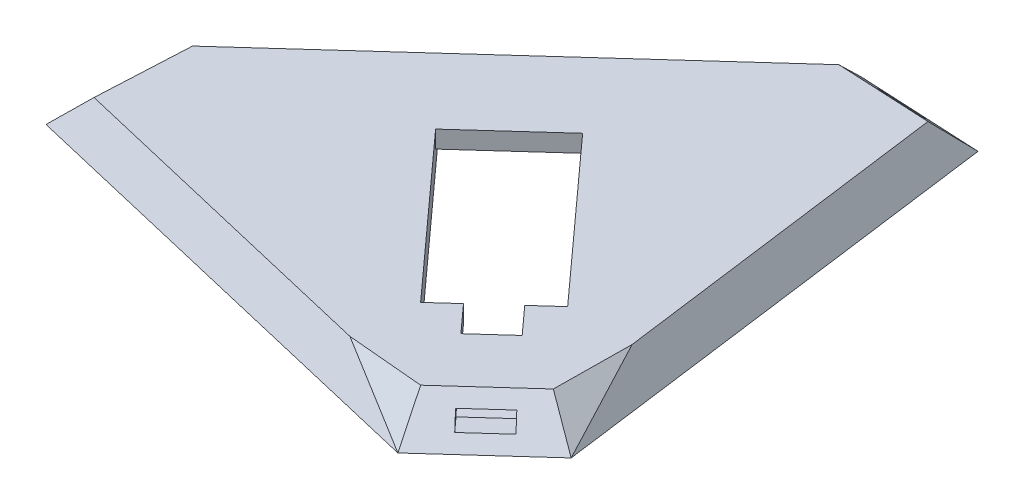
ISO-10303-21;
HEADER;
FILE_DESCRIPTION(('STEP AP214'),'2;1');
FILE_NAME('part.step','',(''),(''),'','','');
FILE_SCHEMA(('AUTOMOTIVE_DESIGN { 1 0 10303 214 1 1 1 1 }'));
ENDSEC;
DATA;
#1=APPLICATION_CONTEXT('core data for automotive mechanical design processes');
#2=APPLICATION_PROTOCOL_DEFINITION('international standard','automotive_design',2000,#1);
#3=PRODUCT_CONTEXT('',#1,'mechanical');
#4=PRODUCT('Part','Part','',(#3));
#5=PRODUCT_RELATED_PRODUCT_CATEGORY('part','',(#4));
#6=PRODUCT_DEFINITION_FORMATION('','',#4);
#7=PRODUCT_DEFINITION_CONTEXT('part definition',#1,'design');
#8=PRODUCT_DEFINITION('design','',#6,#7);
#9=PRODUCT_DEFINITION_SHAPE('','',#8);
#10=(LENGTH_UNIT() NAMED_UNIT(*) SI_UNIT(.MILLI.,.METRE.));
#11=(NAMED_UNIT(*) PLANE_ANGLE_UNIT() SI_UNIT($,.RADIAN.));
#12=(NAMED_UNIT(*) SI_UNIT($,.STERADIAN.) SOLID_ANGLE_UNIT());
#13=UNCERTAINTY_MEASURE_WITH_UNIT(LENGTH_MEASURE(1.E-05),#10,'distance_accuracy_value','');
#14=(GEOMETRIC_REPRESENTATION_CONTEXT(3) GLOBAL_UNCERTAINTY_ASSIGNED_CONTEXT((#13)) GLOBAL_UNIT_ASSIGNED_CONTEXT((#10,
#11,#12)) REPRESENTATION_CONTEXT('',''));
#15=CARTESIAN_POINT('',(0.,0.,0.));
#16=DIRECTION('',(0.,0.,1.));
#17=DIRECTION('',(1.,0.,0.));
#18=AXIS2_PLACEMENT_3D('',#15,#16,#17);
#19=CARTESIAN_POINT('',(108.186209241935,0.,114.22597165535));
#20=DIRECTION('',(0.0352673280829101,0.707106781186549,-0.706226745153347));
#21=DIRECTION('',(0.,0.706666352193045,0.707546936024865));
#22=AXIS2_PLACEMENT_3D('',#19,#20,#21);
#23=PLANE('',#22);
#24=DIRECTION('',(-0.998755441106473,0.,-0.049875533683513));
#25=VECTOR('',#24,1.);
#26=CARTESIAN_POINT('',(108.186209241935,0.,114.22597165535));
#27=LINE('',#26,#25);
#28=CARTESIAN_POINT('',(108.186209241935,0.,114.22597165535));
#29=VERTEX_POINT('',#28);
#30=CARTESIAN_POINT('',(94.0616743388676,0.,113.520625093692));
#31=VERTEX_POINT('',#30);
#32=EDGE_CURVE('E463',#29,#31,#27,.T.);
#33=ORIENTED_EDGE('',*,*,#32,.T.);
#34=DIRECTION('',(-0.246889356738147,-0.678598344545846,-0.691773035257274));
#35=VECTOR('',#34,1.);
#36=CARTESIAN_POINT('',(94.0616743388676,0.,113.520625093692));
#37=LINE('',#36,#35);
#38=CARTESIAN_POINT('',(95.5169644009345,4.00000000000008,117.598283348047));
#39=VERTEX_POINT('',#38);
#40=EDGE_CURVE('E466',#39,#31,#37,.T.);
#41=ORIENTED_EDGE('',*,*,#40,.F.);
#42=DIRECTION('',(0.998755441106473,0.,0.049875533683513));
#43=VECTOR('',#42,1.);
#44=CARTESIAN_POINT('',(107.986707107201,4.00000000000008,118.220993419776));
#45=LINE('',#44,#43);
#46=CARTESIAN_POINT('',(106.327784009475,4.00000000000008,118.138150642221));
#47=VERTEX_POINT('',#46);
#48=EDGE_CURVE('E469',#47,#39,#45,.F.);
#49=ORIENTED_EDGE('',*,*,#48,.F.);
#50=DIRECTION('',(0.315218829121585,-0.678464376432255,-0.663568519204768));
#51=VECTOR('',#50,1.);
#52=CARTESIAN_POINT('',(108.186209241935,0.,114.22597165535));
#53=LINE('',#52,#51);
#54=EDGE_CURVE('E43',#47,#29,#53,.T.);
#55=ORIENTED_EDGE('',*,*,#54,.T.);
#56=EDGE_LOOP('',(#33,#41,#49,#55));
#57=FACE_BOUND('',#56,.T.);
#58=DIRECTION('',(0.0352673280828696,-0.707106781186544,-0.706226745153354));
#59=VECTOR('',#58,1.);
#60=CARTESIAN_POINT('',(98.4910020669571,2.70710678118658,116.452295595768));
#61=LINE('',#60,#59);
#62=CARTESIAN_POINT('',(98.4910020668758,2.70710678118658,116.452295595768));
#63=VERTEX_POINT('',#62);
#64=CARTESIAN_POINT('',(98.5615367231228,1.2928932188135,115.039842105462));
#65=VERTEX_POINT('',#64);
#66=EDGE_CURVE('E56',#63,#65,#61,.T.);
#67=ORIENTED_EDGE('',*,*,#66,.T.);
#68=DIRECTION('',(0.998755441106475,0.,0.0498755336834684));
#69=VECTOR('',#68,1.);
#70=CARTESIAN_POINT('',(103.555313928655,1.29289321881349,115.289219773879));
#71=LINE('',#70,#69);
#72=CARTESIAN_POINT('',(103.555313928655,1.29289321881349,115.289219773879));
#73=VERTEX_POINT('',#72);
#74=EDGE_CURVE('E264',#65,#73,#71,.T.);
#75=ORIENTED_EDGE('',*,*,#74,.T.);
#76=DIRECTION('',(-0.0352673280828836,0.707106781186544,0.706226745153353));
#77=VECTOR('',#76,1.);
#78=CARTESIAN_POINT('',(103.484779272489,2.70710678118658,116.701673264186));
#79=LINE('',#78,#77);
#80=CARTESIAN_POINT('',(103.484779272489,2.70710678118658,116.701673264186));
#81=VERTEX_POINT('',#80);
#82=EDGE_CURVE('E267',#73,#81,#79,.T.);
#83=ORIENTED_EDGE('',*,*,#82,.T.);
#84=DIRECTION('',(-0.998755441106475,0.,-0.0498755336834695));
#85=VECTOR('',#84,1.);
#86=CARTESIAN_POINT('',(103.484779272489,2.70710678118658,116.701673264186));
#87=LINE('',#86,#85);
#88=EDGE_CURVE('E273',#81,#63,#87,.T.);
#89=ORIENTED_EDGE('',*,*,#88,.T.);
#90=EDGE_LOOP('',(#67,#75,#83,#89));
#91=FACE_BOUND('',#90,.T.);
#92=ADVANCED_FACE('F39',(#57,#91),#23,.T.);
#93=CARTESIAN_POINT('',(0.,2.,0.));
#94=DIRECTION('',(0.,1.,0.));
#95=DIRECTION('',(0.,0.,1.));
#96=AXIS2_PLACEMENT_3D('',#93,#94,#95);
#97=PLANE('',#96);
#98=DIRECTION('',(0.741494073236259,0.,-0.670959417070437));
#99=VECTOR('',#98,1.);
#100=CARTESIAN_POINT('',(78.7013108743677,2.,147.26308134938));
#101=LINE('',#100,#99);
#102=CARTESIAN_POINT('',(78.7013108743677,2.,147.26308134938));
#103=VERTEX_POINT('',#102);
#104=CARTESIAN_POINT('',(87.5992397532028,2.,139.211568344535));
#105=VERTEX_POINT('',#104);
#106=EDGE_CURVE('E354',#103,#105,#101,.T.);
#107=ORIENTED_EDGE('',*,*,#106,.F.);
#108=DIRECTION('',(-0.670959417070437,0.,-0.74149407323626));
#109=VECTOR('',#108,1.);
#110=CARTESIAN_POINT('',(75.8497333518184,2.,144.111731538126));
#111=LINE('',#110,#109);
#112=CARTESIAN_POINT('',(75.8497333518184,2.,144.111731538126));
#113=VERTEX_POINT('',#112);
#114=EDGE_CURVE('E428',#103,#113,#111,.T.);
#115=ORIENTED_EDGE('',*,*,#114,.T.);
#116=DIRECTION('',(0.741494073236259,0.,-0.670959417070437));
#117=VECTOR('',#116,1.);
#118=CARTESIAN_POINT('',(84.7476622306535,2.,136.060218533281));
#119=LINE('',#118,#117);
#120=CARTESIAN_POINT('',(84.7476622306535,2.,136.060218533281));
#121=VERTEX_POINT('',#120);
#122=EDGE_CURVE('E416',#113,#121,#119,.T.);
#123=ORIENTED_EDGE('',*,*,#122,.T.);
#124=DIRECTION('',(0.670959417070443,0.,0.741494073236254));
#125=VECTOR('',#124,1.);
#126=CARTESIAN_POINT('',(106.889322993978,2.,160.529522950077));
#127=LINE('',#126,#125);
#128=EDGE_CURVE('E421',#121,#105,#127,.T.);
#129=ORIENTED_EDGE('',*,*,#128,.T.);
#130=EDGE_LOOP('',(#107,#115,#123,#129));
#131=FACE_BOUND('',#130,.T.);
#132=ADVANCED_FACE('F531',(#131),#97,.F.);
#133=DIRECTION('',(-0.741494073236255,0.,0.670959417070442));
#134=VECTOR('',#133,1.);
#135=CARTESIAN_POINT('',(101.442516215102,2.,159.72653109857));
#136=LINE('',#135,#134);
#137=CARTESIAN_POINT('',(104.037745471429,2.,157.378173138823));
#138=VERTEX_POINT('',#137);
#139=CARTESIAN_POINT('',(101.442516215102,2.,159.72653109857));
#140=VERTEX_POINT('',#139);
#141=EDGE_CURVE('E389',#138,#140,#136,.T.);
#142=ORIENTED_EDGE('',*,*,#141,.F.);
#143=CARTESIAN_POINT('',(106.889322993978,2.,160.529522950077));
#144=VERTEX_POINT('',#143);
#145=EDGE_CURVE('E419',#138,#144,#127,.T.);
#146=ORIENTED_EDGE('',*,*,#145,.T.);
#147=DIRECTION('',(-0.741494073236259,0.,0.670959417070438));
#148=VECTOR('',#147,1.);
#149=CARTESIAN_POINT('',(97.9913941151428,2.,168.581035954923));
#150=LINE('',#149,#148);
#151=CARTESIAN_POINT('',(104.294093737651,2.,162.877880909824));
#152=VERTEX_POINT('',#151);
#153=EDGE_CURVE('E425',#144,#152,#150,.T.);
#154=ORIENTED_EDGE('',*,*,#153,.T.);
#155=DIRECTION('',(0.670959417070441,0.,0.741494073236256));
#156=VECTOR('',#155,1.);
#157=CARTESIAN_POINT('',(104.294093737651,2.,162.877880909824));
#158=LINE('',#157,#156);
#159=EDGE_CURVE('E392',#140,#152,#158,.T.);
#160=ORIENTED_EDGE('',*,*,#159,.F.);
#161=EDGE_LOOP('',(#142,#146,#154,#160));
#162=FACE_BOUND('',#161,.T.);
#163=ADVANCED_FACE('F536',(#162),#97,.F.);
#164=DIRECTION('',(-0.670959417070443,0.,-0.741494073236254));
#165=VECTOR('',#164,1.);
#166=CARTESIAN_POINT('',(97.7350458489204,2.,163.081328183922));
#167=LINE('',#166,#165);
#168=CARTESIAN_POINT('',(100.58662337147,2.,166.232677995176));
#169=VERTEX_POINT('',#168);
#170=CARTESIAN_POINT('',(97.7350458489204,2.,163.081328183922));
#171=VERTEX_POINT('',#170);
#172=EDGE_CURVE('E395',#169,#171,#167,.T.);
#173=ORIENTED_EDGE('',*,*,#172,.F.);
#174=CARTESIAN_POINT('',(97.9913941151428,2.,168.581035954923));
#175=VERTEX_POINT('',#174);
#176=EDGE_CURVE('E424',#169,#175,#150,.T.);
#177=ORIENTED_EDGE('',*,*,#176,.T.);
#178=CARTESIAN_POINT('',(95.1398165925934,2.,165.429686143669));
#179=VERTEX_POINT('',#178);
#180=EDGE_CURVE('E429',#175,#179,#111,.T.);
#181=ORIENTED_EDGE('',*,*,#180,.T.);
#182=DIRECTION('',(-0.741494073236255,0.,0.670959417070442));
#183=VECTOR('',#182,1.);
#184=CARTESIAN_POINT('',(95.1398165925934,2.,165.429686143669));
#185=LINE('',#184,#183);
#186=EDGE_CURVE('E365',#171,#179,#185,.T.);
#187=ORIENTED_EDGE('',*,*,#186,.F.);
#188=EDGE_LOOP('',(#173,#177,#181,#187));
#189=FACE_BOUND('',#188,.T.);
#190=ADVANCED_FACE('F539',(#189),#97,.F.);
#191=CARTESIAN_POINT('',(94.0616743388676,0.,113.520625093692));
#192=DIRECTION('',(-0.47443995371148,0.707106781186549,-0.524315487394991));
#193=DIRECTION('',(0.,0.595618213690251,0.803267666173882));
#194=AXIS2_PLACEMENT_3D('',#191,#192,#193);
#195=PLANE('',#194);
#196=DIRECTION('',(-0.741494073236257,0.,0.67095941707044));
#197=VECTOR('',#196,1.);
#198=CARTESIAN_POINT('',(94.0616743388676,0.,113.520625093692));
#199=LINE('',#198,#197);
#200=CARTESIAN_POINT('',(52.494351142564,0.,151.13385485188));
#201=VERTEX_POINT('',#200);
#202=EDGE_CURVE('E444',#31,#201,#199,.T.);
#203=ORIENTED_EDGE('',*,*,#202,.T.);
#204=DIRECTION('',(-0.663734542624745,-0.678598344545847,-0.314580265920094));
#205=VECTOR('',#204,1.);
#206=CARTESIAN_POINT('',(52.494351142564,0.,151.13385485188));
#207=LINE('',#206,#205);
#208=CARTESIAN_POINT('',(56.4067364170607,4.00000000000008,152.988149183415));
#209=VERTEX_POINT('',#208);
#210=EDGE_CURVE('E11',#209,#201,#207,.T.);
#211=ORIENTED_EDGE('',*,*,#210,.F.);
#212=DIRECTION('',(0.741494073236257,0.,-0.67095941707044));
#213=VECTOR('',#212,1.);
#214=CARTESIAN_POINT('',(96.7455120071495,4.00000000000008,116.486601386637));
#215=LINE('',#214,#213);
#216=EDGE_CURVE('E464',#39,#209,#215,.F.);
#217=ORIENTED_EDGE('',*,*,#216,.F.);
#218=ORIENTED_EDGE('',*,*,#40,.T.);
#219=EDGE_LOOP('',(#203,#211,#217,#218));
#220=FACE_BOUND('',#219,.T.);
#221=ADVANCED_FACE('F501',(#220),#195,.T.);
#222=CARTESIAN_POINT('',(52.494351142564,0.,151.13385485188));
#223=DIRECTION('',(-0.706226745153347,0.707106781186549,-0.035267328082918));
#224=DIRECTION('',(-0.707546936024866,-0.706666352193045,0.));
#225=AXIS2_PLACEMENT_3D('',#222,#223,#224);
#226=PLANE('',#225);
#227=DIRECTION('',(-0.0498755336835245,0.,0.998755441106472));
#228=VECTOR('',#227,1.);
#229=CARTESIAN_POINT('',(53.3083247364919,1.29289321881349,160.756461920233));
#230=LINE('',#229,#228);
#231=CARTESIAN_POINT('',(53.5577024049096,1.2928932188135,155.762684714701));
#232=VERTEX_POINT('',#231);
#233=CARTESIAN_POINT('',(53.3083247364919,1.29289321881349,160.756461920233));
#234=VERTEX_POINT('',#233);
#235=EDGE_CURVE('E297',#232,#234,#230,.T.);
#236=ORIENTED_EDGE('',*,*,#235,.F.);
#237=DIRECTION('',(-0.706226745153351,-0.707106781186544,-0.0352673280829275));
#238=VECTOR('',#237,1.);
#239=CARTESIAN_POINT('',(54.9701558952163,2.70710678118658,155.833219370867));
#240=LINE('',#239,#238);
#241=CARTESIAN_POINT('',(54.9701558952163,2.70710678118658,155.833219370867));
#242=VERTEX_POINT('',#241);
#243=EDGE_CURVE('E64',#242,#232,#240,.T.);
#244=ORIENTED_EDGE('',*,*,#243,.F.);
#245=DIRECTION('',(0.0498755336835234,0.,-0.998755441106472));
#246=VECTOR('',#245,1.);
#247=CARTESIAN_POINT('',(54.7207782267987,2.70710678118658,160.826996576399));
#248=LINE('',#247,#246);
#249=CARTESIAN_POINT('',(54.7207782267987,2.70710678118658,160.826996576399));
#250=VERTEX_POINT('',#249);
#251=EDGE_CURVE('E286',#250,#242,#248,.T.);
#252=ORIENTED_EDGE('',*,*,#251,.F.);
#253=DIRECTION('',(0.706226745153352,0.707106781186544,0.0352673280829135));
#254=VECTOR('',#253,1.);
#255=CARTESIAN_POINT('',(54.7207782267987,2.70710678118658,160.826996576399));
#256=LINE('',#255,#254);
#257=EDGE_CURVE('E300',#234,#250,#256,.T.);
#258=ORIENTED_EDGE('',*,*,#257,.F.);
#259=EDGE_LOOP('',(#236,#244,#252,#258));
#260=FACE_BOUND('',#259,.T.);
#261=DIRECTION('',(-0.0498755336835243,0.,0.998755441106472));
#262=VECTOR('',#261,1.);
#263=CARTESIAN_POINT('',(52.494351142564,0.,151.13385485188));
#264=LINE('',#263,#262);
#265=CARTESIAN_POINT('',(51.7890045809056,0.,165.258389754947));
#266=VERTEX_POINT('',#265);
#267=EDGE_CURVE('E453',#201,#266,#264,.T.);
#268=ORIENTED_EDGE('',*,*,#267,.T.);
#269=DIRECTION('',(-0.691671455912489,-0.678464376432254,0.247541283401962));
#270=VECTOR('',#269,1.);
#271=CARTESIAN_POINT('',(51.7890045809056,0.,165.258389754947));
#272=LINE('',#271,#270);
#273=CARTESIAN_POINT('',(55.8668691228861,4.00000000000008,163.798968791956));
#274=VERTEX_POINT('',#273);
#275=EDGE_CURVE('E48',#274,#266,#272,.T.);
#276=ORIENTED_EDGE('',*,*,#275,.F.);
#277=DIRECTION('',(0.0498755336835243,0.,-0.998755441106472));
#278=VECTOR('',#277,1.);
#279=CARTESIAN_POINT('',(56.4893729069899,4.00000000000008,151.333356986615));
#280=LINE('',#279,#278);
#281=EDGE_CURVE('E474',#209,#274,#280,.F.);
#282=ORIENTED_EDGE('',*,*,#281,.F.);
#283=ORIENTED_EDGE('',*,*,#210,.T.);
#284=EDGE_LOOP('',(#268,#276,#282,#283));
#285=FACE_BOUND('',#284,.T.);
#286=ADVANCED_FACE('F505',(#260,#285),#226,.T.);
#287=CARTESIAN_POINT('',(51.7890045809056,0.,165.258389754947));
#288=DIRECTION('',(-0.197707682719737,0.507538362960705,0.838639661783748));
#289=DIRECTION('',(0.,-0.855526887789557,0.517758384064532));
#290=AXIS2_PLACEMENT_3D('',#287,#288,#289);
#291=PLANE('',#290);
#292=DIRECTION('',(0.97331856938779,0.,0.22945797542231));
#293=VECTOR('',#292,1.);
#294=CARTESIAN_POINT('',(51.7890045809056,0.,165.258389754947));
#295=LINE('',#294,#293);
#296=CARTESIAN_POINT('',(104.862009771518,0.,177.77024836284));
#297=VERTEX_POINT('',#296);
#298=EDGE_CURVE('E455',#266,#297,#295,.T.);
#299=ORIENTED_EDGE('',*,*,#298,.T.);
#300=DIRECTION('',(0.855206993932887,-0.328826839150408,0.400616908508149));
#301=VECTOR('',#300,1.);
#302=CARTESIAN_POINT('',(61.758835519302,16.5731578989149,157.578808701664));
#303=LINE('',#302,#301);
#304=CARTESIAN_POINT('',(94.4588809254378,4.00000000000008,172.896961139166));
#305=VERTEX_POINT('',#304);
#306=EDGE_CURVE('E316',#297,#305,#303,.F.);
#307=ORIENTED_EDGE('',*,*,#306,.T.);
#308=DIRECTION('',(-0.97331856938779,0.,-0.22945797542231));
#309=VECTOR('',#308,1.);
#310=CARTESIAN_POINT('',(52.3296488885075,4.00000000000008,162.965075944198));
#311=LINE('',#310,#309);
#312=EDGE_CURVE('E476',#274,#305,#311,.F.);
#313=ORIENTED_EDGE('',*,*,#312,.F.);
#314=ORIENTED_EDGE('',*,*,#275,.T.);
#315=EDGE_LOOP('',(#299,#307,#313,#314));
#316=FACE_BOUND('',#315,.T.);
#317=ADVANCED_FACE('F508',(#316),#291,.T.);
#318=CARTESIAN_POINT('',(104.862009771518,0.,177.770248362839));
#319=DIRECTION('',(0.474439953711478,0.707106781186549,0.524315487394993));
#320=DIRECTION('',(0.,-0.595618213690253,0.80326766617388));
#321=AXIS2_PLACEMENT_3D('',#318,#319,#320);
#322=PLANE('',#321);
#323=DIRECTION('',(0.741494073236262,0.,-0.670959417070434));
#324=VECTOR('',#323,1.);
#325=CARTESIAN_POINT('',(111.09142094813,1.29289321881339,170.389777623971));
#326=LINE('',#325,#324);
#327=CARTESIAN_POINT('',(107.383950581948,1.2928932188134,173.744574709323));
#328=VERTEX_POINT('',#327);
#329=CARTESIAN_POINT('',(111.09142094813,1.29289321881339,170.389777623971));
#330=VERTEX_POINT('',#329);
#331=EDGE_CURVE('E344',#328,#330,#326,.T.);
#332=ORIENTED_EDGE('',*,*,#331,.F.);
#333=DIRECTION('',(0.474439953711438,-0.707106781186541,0.524315487395039));
#334=VECTOR('',#333,1.);
#335=CARTESIAN_POINT('',(107.383950581948,1.2928932188134,173.744574709323));
#336=LINE('',#335,#334);
#337=CARTESIAN_POINT('',(106.435070674525,2.70710678118652,172.695943734533));
#338=VERTEX_POINT('',#337);
#339=EDGE_CURVE('E328',#338,#328,#336,.T.);
#340=ORIENTED_EDGE('',*,*,#339,.F.);
#341=DIRECTION('',(-0.741494073236272,0.,0.670959417070423));
#342=VECTOR('',#341,1.);
#343=CARTESIAN_POINT('',(106.435070674525,2.70710678118652,172.695943734533));
#344=LINE('',#343,#342);
#345=CARTESIAN_POINT('',(110.142541040707,2.70710678118644,169.341146649181));
#346=VERTEX_POINT('',#345);
#347=EDGE_CURVE('E333',#346,#338,#344,.T.);
#348=ORIENTED_EDGE('',*,*,#347,.F.);
#349=DIRECTION('',(-0.474439953711483,0.707106781186542,-0.524315487394996));
#350=VECTOR('',#349,1.);
#351=CARTESIAN_POINT('',(110.142541040707,2.70710678118644,169.341146649181));
#352=LINE('',#351,#350);
#353=EDGE_CURVE('E347',#330,#346,#352,.T.);
#354=ORIENTED_EDGE('',*,*,#353,.F.);
#355=EDGE_LOOP('',(#332,#340,#348,#354));
#356=FACE_BOUND('',#355,.T.);
#357=DIRECTION('',(-0.74149407323626,0.,0.670959417070436));
#358=VECTOR('',#357,1.);
#359=CARTESIAN_POINT('',(102.178172103237,4.00000000000008,174.804272069894));
#360=LINE('',#359,#358);
#361=CARTESIAN_POINT('',(103.406719709451,4.00000000000008,173.692590108484));
#362=VERTEX_POINT('',#361);
#363=CARTESIAN_POINT('',(111.435934244921,4.00000000000008,166.427154957075));
#364=VERTEX_POINT('',#363);
#365=EDGE_CURVE('E477',#362,#364,#360,.F.);
#366=ORIENTED_EDGE('',*,*,#365,.F.);
#367=DIRECTION('',(-0.246889356738093,0.678598344545833,-0.691773035257305));
#368=VECTOR('',#367,1.);
#369=CARTESIAN_POINT('',(107.651326707992,-7.66669685770666,185.585790794207));
#370=LINE('',#369,#368);
#371=EDGE_CURVE('E314',#297,#362,#370,.T.);
#372=ORIENTED_EDGE('',*,*,#371,.F.);
#373=DIRECTION('',(0.74149407323626,0.,-0.670959417070436));
#374=VECTOR('',#373,1.);
#375=CARTESIAN_POINT('',(104.862009771518,0.,177.770248362839));
#376=LINE('',#375,#374);
#377=CARTESIAN_POINT('',(115.348319519418,0.,168.28144928861));
#378=VERTEX_POINT('',#377);
#379=EDGE_CURVE('E458',#297,#378,#376,.T.);
#380=ORIENTED_EDGE('',*,*,#379,.T.);
#381=DIRECTION('',(-0.663734542624743,0.678598344545849,-0.314580265920094));
#382=VECTOR('',#381,1.);
#383=CARTESIAN_POINT('',(122.782641682107,-7.60080783572128,171.804983009826));
#384=LINE('',#383,#382);
#385=EDGE_CURVE('E322',#378,#364,#384,.T.);
#386=ORIENTED_EDGE('',*,*,#385,.T.);
#387=EDGE_LOOP('',(#366,#372,#380,#386));
#388=FACE_BOUND('',#387,.T.);
#389=ADVANCED_FACE('F515',(#356,#388),#322,.T.);
#390=CARTESIAN_POINT('',(115.348319519418,0.,168.28144928861));
#391=DIRECTION('',(0.854164321713108,0.507538362960705,-0.11317297219546));
#392=DIRECTION('',(-0.510820229277899,0.859687555662215,0.));
#393=AXIS2_PLACEMENT_3D('',#390,#391,#392);
#394=PLANE('',#393);
#395=DIRECTION('',(0.131347657892018,0.,0.991336367115764));
#396=VECTOR('',#395,1.);
#397=CARTESIAN_POINT('',(113.012552532834,4.00000000000008,168.590928021809));
#398=LINE('',#397,#396);
#399=CARTESIAN_POINT('',(111.535709269542,4.00000000000008,157.44456683861));
#400=VERTEX_POINT('',#399);
#401=EDGE_CURVE('E471',#400,#47,#398,.F.);
#402=ORIENTED_EDGE('',*,*,#401,.F.);
#403=DIRECTION('',(-0.313422144344909,0.328826839150545,-0.890864450569502));
#404=VECTOR('',#403,1.);
#405=CARTESIAN_POINT('',(115.348319519418,0.,168.28144928861));
#406=LINE('',#405,#404);
#407=EDGE_CURVE('E325',#400,#378,#406,.F.);
#408=ORIENTED_EDGE('',*,*,#407,.T.);
#409=DIRECTION('',(-0.131347657892018,0.,-0.991336367115764));
#410=VECTOR('',#409,1.);
#411=CARTESIAN_POINT('',(115.348319519418,0.,168.28144928861));
#412=LINE('',#411,#410);
#413=EDGE_CURVE('E461',#378,#29,#412,.T.);
#414=ORIENTED_EDGE('',*,*,#413,.T.);
#415=ORIENTED_EDGE('',*,*,#54,.F.);
#416=EDGE_LOOP('',(#402,#408,#414,#415));
#417=FACE_BOUND('',#416,.T.);
#418=ADVANCED_FACE('F41',(#417),#394,.T.);
#419=CARTESIAN_POINT('',(0.,4.00000000000008,0.));
#420=DIRECTION('',(0.,1.,0.));
#421=DIRECTION('',(0.,0.,1.));
#422=AXIS2_PLACEMENT_3D('',#419,#420,#421);
#423=PLANE('',#422);
#424=DIRECTION('',(-0.996070033498332,0.,-0.0885691163252284));
#425=VECTOR('',#424,1.);
#426=CARTESIAN_POINT('',(103.406719709451,4.00000000000008,173.692590108484));
#427=LINE('',#426,#425);
#428=EDGE_CURVE('E307',#362,#305,#427,.T.);
#429=ORIENTED_EDGE('',*,*,#428,.F.);
#430=ORIENTED_EDGE('',*,*,#365,.T.);
#431=DIRECTION('',(-0.0111069180519829,0.,0.999938316283253));
#432=VECTOR('',#431,1.);
#433=CARTESIAN_POINT('',(111.435934244921,4.00000000000008,166.427154957075));
#434=LINE('',#433,#432);
#435=EDGE_CURVE('E319',#400,#364,#434,.T.);
#436=ORIENTED_EDGE('',*,*,#435,.F.);
#437=ORIENTED_EDGE('',*,*,#401,.T.);
#438=ORIENTED_EDGE('',*,*,#48,.T.);
#439=ORIENTED_EDGE('',*,*,#216,.T.);
#440=ORIENTED_EDGE('',*,*,#281,.T.);
#441=ORIENTED_EDGE('',*,*,#312,.T.);
#442=EDGE_LOOP('',(#429,#430,#436,#437,#438,#439,#440,#441));
#443=FACE_BOUND('',#442,.T.);
#444=DIRECTION('',(-0.670959417070437,0.,-0.741494073236259));
#445=VECTOR('',#444,1.);
#446=CARTESIAN_POINT('',(78.7013108743677,4.00000000000008,147.26308134938));
#447=LINE('',#446,#445);
#448=CARTESIAN_POINT('',(95.1398165925934,4.00000000000008,165.429686143669));
#449=VERTEX_POINT('',#448);
#450=CARTESIAN_POINT('',(78.7013108743677,4.00000000000008,147.26308134938));
#451=VERTEX_POINT('',#450);
#452=EDGE_CURVE('E361',#449,#451,#447,.T.);
#453=ORIENTED_EDGE('',*,*,#452,.T.);
#454=DIRECTION('',(0.741494073236259,0.,-0.670959417070437));
#455=VECTOR('',#454,1.);
#456=CARTESIAN_POINT('',(78.7013108743677,4.00000000000008,147.26308134938));
#457=LINE('',#456,#455);
#458=CARTESIAN_POINT('',(87.5992397532028,4.00000000000008,139.211568344535));
#459=VERTEX_POINT('',#458);
#460=EDGE_CURVE('E364',#451,#459,#457,.T.);
#461=ORIENTED_EDGE('',*,*,#460,.T.);
#462=DIRECTION('',(0.670959417070443,0.,0.741494073236254));
#463=VECTOR('',#462,1.);
#464=CARTESIAN_POINT('',(104.037745471429,4.00000000000008,157.378173138823));
#465=LINE('',#464,#463);
#466=CARTESIAN_POINT('',(104.037745471429,4.00000000000008,157.378173138823));
#467=VERTEX_POINT('',#466);
#468=EDGE_CURVE('E368',#459,#467,#465,.T.);
#469=ORIENTED_EDGE('',*,*,#468,.T.);
#470=DIRECTION('',(-0.741494073236255,0.,0.670959417070442));
#471=VECTOR('',#470,1.);
#472=CARTESIAN_POINT('',(101.442516215102,4.00000000000008,159.72653109857));
#473=LINE('',#472,#471);
#474=CARTESIAN_POINT('',(101.442516215102,4.00000000000008,159.72653109857));
#475=VERTEX_POINT('',#474);
#476=EDGE_CURVE('E371',#467,#475,#473,.T.);
#477=ORIENTED_EDGE('',*,*,#476,.T.);
#478=DIRECTION('',(0.670959417070441,0.,0.741494073236256));
#479=VECTOR('',#478,1.);
#480=CARTESIAN_POINT('',(104.294093737651,4.00000000000008,162.877880909824));
#481=LINE('',#480,#479);
#482=CARTESIAN_POINT('',(104.294093737651,4.00000000000008,162.877880909824));
#483=VERTEX_POINT('',#482);
#484=EDGE_CURVE('E374',#475,#483,#481,.T.);
#485=ORIENTED_EDGE('',*,*,#484,.T.);
#486=DIRECTION('',(-0.741494073236259,0.,0.670959417070438));
#487=VECTOR('',#486,1.);
#488=CARTESIAN_POINT('',(100.58662337147,4.00000000000008,166.232677995176));
#489=LINE('',#488,#487);
#490=CARTESIAN_POINT('',(100.58662337147,4.00000000000008,166.232677995176));
#491=VERTEX_POINT('',#490);
#492=EDGE_CURVE('E377',#483,#491,#489,.T.);
#493=ORIENTED_EDGE('',*,*,#492,.T.);
#494=DIRECTION('',(-0.670959417070443,0.,-0.741494073236254));
#495=VECTOR('',#494,1.);
#496=CARTESIAN_POINT('',(97.7350458489204,4.00000000000008,163.081328183922));
#497=LINE('',#496,#495);
#498=CARTESIAN_POINT('',(97.7350458489204,4.00000000000008,163.081328183922));
#499=VERTEX_POINT('',#498);
#500=EDGE_CURVE('E380',#491,#499,#497,.T.);
#501=ORIENTED_EDGE('',*,*,#500,.T.);
#502=DIRECTION('',(-0.741494073236255,0.,0.670959417070442));
#503=VECTOR('',#502,1.);
#504=CARTESIAN_POINT('',(95.1398165925934,4.00000000000008,165.429686143669));
#505=LINE('',#504,#503);
#506=EDGE_CURVE('E383',#499,#449,#505,.T.);
#507=ORIENTED_EDGE('',*,*,#506,.T.);
#508=EDGE_LOOP('',(#453,#461,#469,#477,#485,#493,#501,#507));
#509=FACE_BOUND('',#508,.T.);
#510=ADVANCED_FACE('F487',(#443,#509),#423,.T.);
#511=CARTESIAN_POINT('',(0.,0.,0.));
#512=DIRECTION('',(0.,1.,0.));
#513=DIRECTION('',(0.,0.,1.));
#514=AXIS2_PLACEMENT_3D('',#511,#512,#513);
#515=PLANE('',#514);
#516=DIRECTION('',(0.670959417070443,0.,0.741494073236254));
#517=VECTOR('',#516,1.);
#518=CARTESIAN_POINT('',(106.889322993978,0.,160.529522950077));
#519=LINE('',#518,#517);
#520=CARTESIAN_POINT('',(84.7476622306535,0.,136.060218533281));
#521=VERTEX_POINT('',#520);
#522=CARTESIAN_POINT('',(106.889322993978,0.,160.529522950077));
#523=VERTEX_POINT('',#522);
#524=EDGE_CURVE('E434',#521,#523,#519,.T.);
#525=ORIENTED_EDGE('',*,*,#524,.F.);
#526=DIRECTION('',(0.741494073236259,0.,-0.670959417070437));
#527=VECTOR('',#526,1.);
#528=CARTESIAN_POINT('',(84.7476622306535,0.,136.060218533281));
#529=LINE('',#528,#527);
#530=CARTESIAN_POINT('',(75.8497333518184,0.,144.111731538126));
#531=VERTEX_POINT('',#530);
#532=EDGE_CURVE('E401',#531,#521,#529,.T.);
#533=ORIENTED_EDGE('',*,*,#532,.F.);
#534=DIRECTION('',(-0.670959417070437,0.,-0.74149407323626));
#535=VECTOR('',#534,1.);
#536=CARTESIAN_POINT('',(75.8497333518184,0.,144.111731538126));
#537=LINE('',#536,#535);
#538=CARTESIAN_POINT('',(97.9913941151428,0.,168.581035954923));
#539=VERTEX_POINT('',#538);
#540=EDGE_CURVE('E420',#539,#531,#537,.T.);
#541=ORIENTED_EDGE('',*,*,#540,.F.);
#542=DIRECTION('',(-0.741494073236259,0.,0.670959417070438));
#543=VECTOR('',#542,1.);
#544=CARTESIAN_POINT('',(97.9913941151428,0.,168.581035954923));
#545=LINE('',#544,#543);
#546=EDGE_CURVE('E437',#523,#539,#545,.T.);
#547=ORIENTED_EDGE('',*,*,#546,.F.);
#548=EDGE_LOOP('',(#525,#533,#541,#547));
#549=FACE_BOUND('',#548,.T.);
#550=ORIENTED_EDGE('',*,*,#202,.F.);
#551=ORIENTED_EDGE('',*,*,#32,.F.);
#552=ORIENTED_EDGE('',*,*,#413,.F.);
#553=ORIENTED_EDGE('',*,*,#379,.F.);
#554=ORIENTED_EDGE('',*,*,#298,.F.);
#555=ORIENTED_EDGE('',*,*,#267,.F.);
#556=EDGE_LOOP('',(#550,#551,#552,#553,#554,#555));
#557=FACE_BOUND('',#556,.T.);
#558=ADVANCED_FACE('F908',(#549,#557),#515,.F.);
#559=CARTESIAN_POINT('',(84.7476622306535,2.,136.060218533281));
#560=DIRECTION('',(-0.670959417070437,0.,-0.741494073236259));
#561=DIRECTION('',(-0.741494073236259,0.,0.670959417070437));
#562=AXIS2_PLACEMENT_3D('',#559,#560,#561);
#563=PLANE('',#562);
#564=ORIENTED_EDGE('',*,*,#532,.T.);
#565=DIRECTION('',(0.,-1.,0.));
#566=VECTOR('',#565,1.);
#567=CARTESIAN_POINT('',(84.7476622306535,2.,136.060218533281));
#568=LINE('',#567,#566);
#569=EDGE_CURVE('E432',#121,#521,#568,.T.);
#570=ORIENTED_EDGE('',*,*,#569,.F.);
#571=ORIENTED_EDGE('',*,*,#122,.F.);
#572=DIRECTION('',(0.,-1.,0.));
#573=VECTOR('',#572,1.);
#574=CARTESIAN_POINT('',(75.8497333518184,2.,144.111731538126));
#575=LINE('',#574,#573);
#576=EDGE_CURVE('E442',#113,#531,#575,.T.);
#577=ORIENTED_EDGE('',*,*,#576,.T.);
#578=EDGE_LOOP('',(#564,#570,#571,#577));
#579=FACE_BOUND('',#578,.T.);
#580=ADVANCED_FACE('F871',(#579),#563,.F.);
#581=CARTESIAN_POINT('',(75.8497333518184,2.,144.111731538126));
#582=DIRECTION('',(-0.74149407323626,0.,0.670959417070437));
#583=DIRECTION('',(0.670959417070437,0.,0.74149407323626));
#584=AXIS2_PLACEMENT_3D('',#581,#582,#583);
#585=PLANE('',#584);
#586=ORIENTED_EDGE('',*,*,#540,.T.);
#587=ORIENTED_EDGE('',*,*,#576,.F.);
#588=ORIENTED_EDGE('',*,*,#114,.F.);
#589=DIRECTION('',(0.,-1.,0.));
#590=VECTOR('',#589,1.);
#591=CARTESIAN_POINT('',(78.7013108743677,4.00000000000008,147.26308134938));
#592=LINE('',#591,#590);
#593=EDGE_CURVE('E386',#451,#103,#592,.T.);
#594=ORIENTED_EDGE('',*,*,#593,.F.);
#595=ORIENTED_EDGE('',*,*,#452,.F.);
#596=DIRECTION('',(0.,-1.,0.));
#597=VECTOR('',#596,1.);
#598=CARTESIAN_POINT('',(95.1398165925934,4.00000000000008,165.429686143669));
#599=LINE('',#598,#597);
#600=EDGE_CURVE('E399',#449,#179,#599,.T.);
#601=ORIENTED_EDGE('',*,*,#600,.T.);
#602=ORIENTED_EDGE('',*,*,#180,.F.);
#603=DIRECTION('',(0.,-1.,0.));
#604=VECTOR('',#603,1.);
#605=CARTESIAN_POINT('',(97.9913941151428,2.,168.581035954923));
#606=LINE('',#605,#604);
#607=EDGE_CURVE('E445',#175,#539,#606,.T.);
#608=ORIENTED_EDGE('',*,*,#607,.T.);
#609=EDGE_LOOP('',(#586,#587,#588,#594,#595,#601,#602,#608));
#610=FACE_BOUND('',#609,.T.);
#611=ADVANCED_FACE('F857',(#610),#585,.F.);
#612=CARTESIAN_POINT('',(97.9913941151428,2.,168.581035954923));
#613=DIRECTION('',(0.670959417070438,0.,0.741494073236259));
#614=DIRECTION('',(0.741494073236259,0.,-0.670959417070438));
#615=AXIS2_PLACEMENT_3D('',#612,#613,#614);
#616=PLANE('',#615);
#617=ORIENTED_EDGE('',*,*,#546,.T.);
#618=ORIENTED_EDGE('',*,*,#607,.F.);
#619=ORIENTED_EDGE('',*,*,#176,.F.);
#620=DIRECTION('',(0.,-1.,0.));
#621=VECTOR('',#620,1.);
#622=CARTESIAN_POINT('',(100.58662337147,4.00000000000008,166.232677995176));
#623=LINE('',#622,#621);
#624=EDGE_CURVE('E405',#491,#169,#623,.T.);
#625=ORIENTED_EDGE('',*,*,#624,.F.);
#626=ORIENTED_EDGE('',*,*,#492,.F.);
#627=DIRECTION('',(0.,-1.,0.));
#628=VECTOR('',#627,1.);
#629=CARTESIAN_POINT('',(104.294093737651,4.00000000000008,162.877880909824));
#630=LINE('',#629,#628);
#631=EDGE_CURVE('E407',#483,#152,#630,.T.);
#632=ORIENTED_EDGE('',*,*,#631,.T.);
#633=ORIENTED_EDGE('',*,*,#153,.F.);
#634=DIRECTION('',(0.,-1.,0.));
#635=VECTOR('',#634,1.);
#636=CARTESIAN_POINT('',(106.889322993978,2.,160.529522950077));
#637=LINE('',#636,#635);
#638=EDGE_CURVE('E447',#144,#523,#637,.T.);
#639=ORIENTED_EDGE('',*,*,#638,.T.);
#640=EDGE_LOOP('',(#617,#618,#619,#625,#626,#632,#633,#639));
#641=FACE_BOUND('',#640,.T.);
#642=ADVANCED_FACE('F842',(#641),#616,.F.);
#643=CARTESIAN_POINT('',(106.889322993978,2.,160.529522950077));
#644=DIRECTION('',(0.741494073236254,0.,-0.670959417070443));
#645=DIRECTION('',(-0.670959417070443,0.,-0.741494073236254));
#646=AXIS2_PLACEMENT_3D('',#643,#644,#645);
#647=PLANE('',#646);
#648=ORIENTED_EDGE('',*,*,#524,.T.);
#649=ORIENTED_EDGE('',*,*,#638,.F.);
#650=ORIENTED_EDGE('',*,*,#145,.F.);
#651=DIRECTION('',(0.,-1.,0.));
#652=VECTOR('',#651,1.);
#653=CARTESIAN_POINT('',(104.037745471429,4.00000000000008,157.378173138823));
#654=LINE('',#653,#652);
#655=EDGE_CURVE('E411',#467,#138,#654,.T.);
#656=ORIENTED_EDGE('',*,*,#655,.F.);
#657=ORIENTED_EDGE('',*,*,#468,.F.);
#658=DIRECTION('',(0.,-1.,0.));
#659=VECTOR('',#658,1.);
#660=CARTESIAN_POINT('',(87.5992397532028,4.00000000000008,139.211568344535));
#661=LINE('',#660,#659);
#662=EDGE_CURVE('E413',#459,#105,#661,.T.);
#663=ORIENTED_EDGE('',*,*,#662,.T.);
#664=ORIENTED_EDGE('',*,*,#128,.F.);
#665=ORIENTED_EDGE('',*,*,#569,.T.);
#666=EDGE_LOOP('',(#648,#649,#650,#656,#657,#663,#664,#665));
#667=FACE_BOUND('',#666,.T.);
#668=ADVANCED_FACE('F829',(#667),#647,.F.);
#669=CARTESIAN_POINT('',(95.1398165925934,4.00000000000008,165.429686143669));
#670=DIRECTION('',(0.670959417070442,0.,0.741494073236255));
#671=DIRECTION('',(0.741494073236255,0.,-0.670959417070442));
#672=AXIS2_PLACEMENT_3D('',#669,#670,#671);
#673=PLANE('',#672);
#674=ORIENTED_EDGE('',*,*,#186,.T.);
#675=ORIENTED_EDGE('',*,*,#600,.F.);
#676=ORIENTED_EDGE('',*,*,#506,.F.);
#677=DIRECTION('',(0.,-1.,0.));
#678=VECTOR('',#677,1.);
#679=CARTESIAN_POINT('',(97.7350458489204,4.00000000000008,163.081328183922));
#680=LINE('',#679,#678);
#681=EDGE_CURVE('E402',#499,#171,#680,.T.);
#682=ORIENTED_EDGE('',*,*,#681,.T.);
#683=EDGE_LOOP('',(#674,#675,#676,#682));
#684=FACE_BOUND('',#683,.T.);
#685=ADVANCED_FACE('F817',(#684),#673,.F.);
#686=CARTESIAN_POINT('',(97.7350458489204,4.00000000000008,163.081328183922));
#687=DIRECTION('',(-0.741494073236254,0.,0.670959417070443));
#688=DIRECTION('',(0.670959417070443,0.,0.741494073236254));
#689=AXIS2_PLACEMENT_3D('',#686,#687,#688);
#690=PLANE('',#689);
#691=ORIENTED_EDGE('',*,*,#172,.T.);
#692=ORIENTED_EDGE('',*,*,#681,.F.);
#693=ORIENTED_EDGE('',*,*,#500,.F.);
#694=ORIENTED_EDGE('',*,*,#624,.T.);
#695=EDGE_LOOP('',(#691,#692,#693,#694));
#696=FACE_BOUND('',#695,.T.);
#697=ADVANCED_FACE('F805',(#696),#690,.F.);
#698=CARTESIAN_POINT('',(104.294093737651,4.00000000000008,162.877880909824));
#699=DIRECTION('',(0.741494073236256,0.,-0.670959417070441));
#700=DIRECTION('',(-0.670959417070441,0.,-0.741494073236256));
#701=AXIS2_PLACEMENT_3D('',#698,#699,#700);
#702=PLANE('',#701);
#703=ORIENTED_EDGE('',*,*,#159,.T.);
#704=ORIENTED_EDGE('',*,*,#631,.F.);
#705=ORIENTED_EDGE('',*,*,#484,.F.);
#706=DIRECTION('',(0.,-1.,0.));
#707=VECTOR('',#706,1.);
#708=CARTESIAN_POINT('',(101.442516215102,4.00000000000008,159.72653109857));
#709=LINE('',#708,#707);
#710=EDGE_CURVE('E409',#475,#140,#709,.T.);
#711=ORIENTED_EDGE('',*,*,#710,.T.);
#712=EDGE_LOOP('',(#703,#704,#705,#711));
#713=FACE_BOUND('',#712,.T.);
#714=ADVANCED_FACE('F793',(#713),#702,.F.);
#715=CARTESIAN_POINT('',(101.442516215102,4.00000000000008,159.72653109857));
#716=DIRECTION('',(0.670959417070442,0.,0.741494073236255));
#717=DIRECTION('',(0.741494073236255,0.,-0.670959417070442));
#718=AXIS2_PLACEMENT_3D('',#715,#716,#717);
#719=PLANE('',#718);
#720=ORIENTED_EDGE('',*,*,#141,.T.);
#721=ORIENTED_EDGE('',*,*,#710,.F.);
#722=ORIENTED_EDGE('',*,*,#476,.F.);
#723=ORIENTED_EDGE('',*,*,#655,.T.);
#724=EDGE_LOOP('',(#720,#721,#722,#723));
#725=FACE_BOUND('',#724,.T.);
#726=ADVANCED_FACE('F781',(#725),#719,.F.);
#727=CARTESIAN_POINT('',(78.7013108743677,4.00000000000008,147.26308134938));
#728=DIRECTION('',(-0.670959417070437,0.,-0.741494073236259));
#729=DIRECTION('',(-0.741494073236259,0.,0.670959417070437));
#730=AXIS2_PLACEMENT_3D('',#727,#728,#729);
#731=PLANE('',#730);
#732=ORIENTED_EDGE('',*,*,#106,.T.);
#733=ORIENTED_EDGE('',*,*,#662,.F.);
#734=ORIENTED_EDGE('',*,*,#460,.F.);
#735=ORIENTED_EDGE('',*,*,#593,.T.);
#736=EDGE_LOOP('',(#732,#733,#734,#735));
#737=FACE_BOUND('',#736,.T.);
#738=ADVANCED_FACE('F769',(#737),#731,.F.);
#739=CARTESIAN_POINT('',(105.907839864393,1.2928932188134,172.113287748204));
#740=DIRECTION('',(-0.74149407323626,0.,0.670959417070437));
#741=DIRECTION('',(0.670959417070437,0.,0.74149407323626));
#742=AXIS2_PLACEMENT_3D('',#739,#740,#741);
#743=PLANE('',#742);
#744=ORIENTED_EDGE('',*,*,#339,.T.);
#745=DIRECTION('',(0.670959417070437,0.,0.74149407323626));
#746=VECTOR('',#745,1.);
#747=CARTESIAN_POINT('',(105.907839864393,1.2928932188134,172.113287748204));
#748=LINE('',#747,#746);
#749=CARTESIAN_POINT('',(105.907839864393,1.2928932188134,172.113287748204));
#750=VERTEX_POINT('',#749);
#751=EDGE_CURVE('E342',#750,#328,#748,.T.);
#752=ORIENTED_EDGE('',*,*,#751,.F.);
#753=DIRECTION('',(0.474439953711438,-0.707106781186541,0.524315487395039));
#754=VECTOR('',#753,1.);
#755=CARTESIAN_POINT('',(105.907839864393,1.2928932188134,172.113287748204));
#756=LINE('',#755,#754);
#757=CARTESIAN_POINT('',(104.95895995697,2.70710678118652,171.064656773413));
#758=VERTEX_POINT('',#757);
#759=EDGE_CURVE('E329',#758,#750,#756,.T.);
#760=ORIENTED_EDGE('',*,*,#759,.F.);
#761=DIRECTION('',(0.670959417070437,0.,0.74149407323626));
#762=VECTOR('',#761,1.);
#763=CARTESIAN_POINT('',(104.95895995697,2.70710678118652,171.064656773413));
#764=LINE('',#763,#762);
#765=EDGE_CURVE('E352',#758,#338,#764,.T.);
#766=ORIENTED_EDGE('',*,*,#765,.T.);
#767=EDGE_LOOP('',(#744,#752,#760,#766));
#768=FACE_BOUND('',#767,.T.);
#769=ADVANCED_FACE('F757',(#768),#743,.F.);
#770=CARTESIAN_POINT('',(104.95895995697,2.70710678118652,171.064656773413));
#771=DIRECTION('',(0.,1.,0.));
#772=DIRECTION('',(-1.,0.,0.));
#773=AXIS2_PLACEMENT_3D('',#770,#771,#772);
#774=PLANE('',#773);
#775=ORIENTED_EDGE('',*,*,#347,.T.);
#776=ORIENTED_EDGE('',*,*,#765,.F.);
#777=DIRECTION('',(-0.741494073236272,0.,0.670959417070423));
#778=VECTOR('',#777,1.);
#779=CARTESIAN_POINT('',(104.95895995697,2.70710678118652,171.064656773413));
#780=LINE('',#779,#778);
#781=CARTESIAN_POINT('',(108.666430323152,2.70710678118644,167.709859688061));
#782=VERTEX_POINT('',#781);
#783=EDGE_CURVE('E339',#782,#758,#780,.T.);
#784=ORIENTED_EDGE('',*,*,#783,.F.);
#785=DIRECTION('',(0.670959417070437,0.,0.74149407323626));
#786=VECTOR('',#785,1.);
#787=CARTESIAN_POINT('',(108.666430323152,2.70710678118644,167.709859688061));
#788=LINE('',#787,#786);
#789=EDGE_CURVE('E355',#782,#346,#788,.T.);
#790=ORIENTED_EDGE('',*,*,#789,.T.);
#791=EDGE_LOOP('',(#775,#776,#784,#790));
#792=FACE_BOUND('',#791,.T.);
#793=ADVANCED_FACE('F745',(#792),#774,.F.);
#794=CARTESIAN_POINT('',(108.666430323152,2.70710678118644,167.709859688061));
#795=DIRECTION('',(0.74149407323626,0.,-0.670959417070436));
#796=DIRECTION('',(-0.670959417070437,0.,-0.74149407323626));
#797=AXIS2_PLACEMENT_3D('',#794,#795,#796);
#798=PLANE('',#797);
#799=ORIENTED_EDGE('',*,*,#353,.T.);
#800=ORIENTED_EDGE('',*,*,#789,.F.);
#801=DIRECTION('',(-0.474439953711483,0.707106781186542,-0.524315487394996));
#802=VECTOR('',#801,1.);
#803=CARTESIAN_POINT('',(108.666430323152,2.70710678118644,167.709859688061));
#804=LINE('',#803,#802);
#805=CARTESIAN_POINT('',(109.615310230575,1.29289321881339,168.758490662851));
#806=VERTEX_POINT('',#805);
#807=EDGE_CURVE('E336',#806,#782,#804,.T.);
#808=ORIENTED_EDGE('',*,*,#807,.F.);
#809=DIRECTION('',(0.670959417070437,0.,0.74149407323626));
#810=VECTOR('',#809,1.);
#811=CARTESIAN_POINT('',(109.615310230575,1.29289321881339,168.758490662851));
#812=LINE('',#811,#810);
#813=EDGE_CURVE('E357',#806,#330,#812,.T.);
#814=ORIENTED_EDGE('',*,*,#813,.T.);
#815=EDGE_LOOP('',(#799,#800,#808,#814));
#816=FACE_BOUND('',#815,.T.);
#817=ADVANCED_FACE('F733',(#816),#798,.F.);
#818=CARTESIAN_POINT('',(109.615310230575,1.29289321881339,168.758490662851));
#819=DIRECTION('',(0.,-1.,0.));
#820=DIRECTION('',(1.,0.,0.));
#821=AXIS2_PLACEMENT_3D('',#818,#819,#820);
#822=PLANE('',#821);
#823=ORIENTED_EDGE('',*,*,#331,.T.);
#824=ORIENTED_EDGE('',*,*,#813,.F.);
#825=DIRECTION('',(0.741494073236262,0.,-0.670959417070434));
#826=VECTOR('',#825,1.);
#827=CARTESIAN_POINT('',(109.615310230575,1.29289321881339,168.758490662851));
#828=LINE('',#827,#826);
#829=EDGE_CURVE('E332',#750,#806,#828,.T.);
#830=ORIENTED_EDGE('',*,*,#829,.F.);
#831=ORIENTED_EDGE('',*,*,#751,.T.);
#832=EDGE_LOOP('',(#823,#824,#830,#831));
#833=FACE_BOUND('',#832,.T.);
#834=ADVANCED_FACE('F527',(#833),#822,.F.);
#835=CARTESIAN_POINT('',(66.3490761505547,101.086869253958,73.3240274726975));
#836=DIRECTION('',(-0.474439953711474,-0.707106781186554,-0.52431548739499));
#837=DIRECTION('',(0.,0.595618213690247,-0.803267666173884));
#838=AXIS2_PLACEMENT_3D('',#835,#836,#837);
#839=PLANE('',#838);
#840=ORIENTED_EDGE('',*,*,#759,.T.);
#841=ORIENTED_EDGE('',*,*,#829,.T.);
#842=ORIENTED_EDGE('',*,*,#807,.T.);
#843=ORIENTED_EDGE('',*,*,#783,.T.);
#844=EDGE_LOOP('',(#840,#841,#842,#843));
#845=FACE_BOUND('',#844,.T.);
#846=ADVANCED_FACE('F519',(#845),#839,.F.);
#847=CARTESIAN_POINT('',(122.782641682107,-7.60080783572128,171.804983009826));
#848=DIRECTION('',(-0.713032621587867,-0.701086123689445,-0.00792008343655025));
#849=DIRECTION('',(0.701108113491585,-0.713054986095932,0.));
#850=AXIS2_PLACEMENT_3D('',#847,#848,#849);
#851=PLANE('',#850);
#852=ORIENTED_EDGE('',*,*,#435,.T.);
#853=ORIENTED_EDGE('',*,*,#385,.F.);
#854=ORIENTED_EDGE('',*,*,#407,.F.);
#855=EDGE_LOOP('',(#852,#853,#854));
#856=FACE_BOUND('',#855,.T.);
#857=ADVANCED_FACE('F517',(#856),#851,.F.);
#858=CARTESIAN_POINT('',(107.651326707992,-7.66669685770666,185.585790794207));
#859=DIRECTION('',(0.0631565649367588,-0.701086123689466,-0.710274239625419));
#860=DIRECTION('',(0.,0.711695045260205,-0.702488549765813));
#861=AXIS2_PLACEMENT_3D('',#858,#859,#860);
#862=PLANE('',#861);
#863=ORIENTED_EDGE('',*,*,#371,.T.);
#864=ORIENTED_EDGE('',*,*,#428,.T.);
#865=ORIENTED_EDGE('',*,*,#306,.F.);
#866=EDGE_LOOP('',(#863,#864,#865));
#867=FACE_BOUND('',#866,.T.);
#868=ADVANCED_FACE('F512',(#867),#862,.F.);
#869=CARTESIAN_POINT('',(57.1674178656505,2.70710678118658,155.942945544971));
#870=DIRECTION('',(0.049875533683524,0.,-0.998755441106472));
#871=DIRECTION('',(-0.998755441106472,0.,-0.049875533683524));
#872=AXIS2_PLACEMENT_3D('',#869,#870,#871);
#873=PLANE('',#872);
#874=ORIENTED_EDGE('',*,*,#243,.T.);
#875=DIRECTION('',(-0.998755441106472,0.,-0.049875533683524));
#876=VECTOR('',#875,1.);
#877=CARTESIAN_POINT('',(55.7549643753438,1.2928932188135,155.872410888805));
#878=LINE('',#877,#876);
#879=CARTESIAN_POINT('',(55.7549643753438,1.2928932188135,155.872410888805));
#880=VERTEX_POINT('',#879);
#881=EDGE_CURVE('E295',#880,#232,#878,.T.);
#882=ORIENTED_EDGE('',*,*,#881,.F.);
#883=DIRECTION('',(-0.706226745153351,-0.707106781186544,-0.0352673280829275));
#884=VECTOR('',#883,1.);
#885=CARTESIAN_POINT('',(57.1674178656505,2.70710678118658,155.942945544971));
#886=LINE('',#885,#884);
#887=CARTESIAN_POINT('',(57.1674178656505,2.70710678118658,155.942945544971));
#888=VERTEX_POINT('',#887);
#889=EDGE_CURVE('E282',#888,#880,#886,.T.);
#890=ORIENTED_EDGE('',*,*,#889,.F.);
#891=DIRECTION('',(-0.998755441106472,0.,-0.049875533683524));
#892=VECTOR('',#891,1.);
#893=CARTESIAN_POINT('',(57.1674178656505,2.70710678118658,155.942945544971));
#894=LINE('',#893,#892);
#895=EDGE_CURVE('E305',#888,#242,#894,.T.);
#896=ORIENTED_EDGE('',*,*,#895,.T.);
#897=EDGE_LOOP('',(#874,#882,#890,#896));
#898=FACE_BOUND('',#897,.T.);
#899=ADVANCED_FACE('F525',(#898),#873,.F.);
#900=CARTESIAN_POINT('',(56.9180401972329,2.70710678118658,160.936722750503));
#901=DIRECTION('',(0.,1.,0.));
#902=DIRECTION('',(0.,0.,1.));
#903=AXIS2_PLACEMENT_3D('',#900,#901,#902);
#904=PLANE('',#903);
#905=ORIENTED_EDGE('',*,*,#251,.T.);
#906=ORIENTED_EDGE('',*,*,#895,.F.);
#907=DIRECTION('',(0.0498755336835234,0.,-0.998755441106472));
#908=VECTOR('',#907,1.);
#909=CARTESIAN_POINT('',(56.9180401972329,2.70710678118658,160.936722750503));
#910=LINE('',#909,#908);
#911=CARTESIAN_POINT('',(56.9180401972329,2.70710678118658,160.936722750503));
#912=VERTEX_POINT('',#911);
#913=EDGE_CURVE('E292',#912,#888,#910,.T.);
#914=ORIENTED_EDGE('',*,*,#913,.F.);
#915=DIRECTION('',(-0.998755441106472,0.,-0.049875533683524));
#916=VECTOR('',#915,1.);
#917=CARTESIAN_POINT('',(56.9180401972329,2.70710678118658,160.936722750503));
#918=LINE('',#917,#916);
#919=EDGE_CURVE('E308',#912,#250,#918,.T.);
#920=ORIENTED_EDGE('',*,*,#919,.T.);
#921=EDGE_LOOP('',(#905,#906,#914,#920));
#922=FACE_BOUND('',#921,.T.);
#923=ADVANCED_FACE('F565',(#922),#904,.F.);
#924=CARTESIAN_POINT('',(56.9180401972329,2.70710678118658,160.936722750503));
#925=DIRECTION('',(-0.049875533683524,0.,0.998755441106472));
#926=DIRECTION('',(0.998755441106472,0.,0.049875533683524));
#927=AXIS2_PLACEMENT_3D('',#924,#925,#926);
#928=PLANE('',#927);
#929=ORIENTED_EDGE('',*,*,#257,.T.);
#930=ORIENTED_EDGE('',*,*,#919,.F.);
#931=DIRECTION('',(0.706226745153352,0.707106781186544,0.0352673280829135));
#932=VECTOR('',#931,1.);
#933=CARTESIAN_POINT('',(56.9180401972329,2.70710678118658,160.936722750503));
#934=LINE('',#933,#932);
#935=CARTESIAN_POINT('',(55.5055867069262,1.29289321881349,160.866188094337));
#936=VERTEX_POINT('',#935);
#937=EDGE_CURVE('E289',#936,#912,#934,.T.);
#938=ORIENTED_EDGE('',*,*,#937,.F.);
#939=DIRECTION('',(-0.998755441106472,0.,-0.049875533683524));
#940=VECTOR('',#939,1.);
#941=CARTESIAN_POINT('',(55.5055867069262,1.29289321881349,160.866188094337));
#942=LINE('',#941,#940);
#943=EDGE_CURVE('E310',#936,#234,#942,.T.);
#944=ORIENTED_EDGE('',*,*,#943,.T.);
#945=EDGE_LOOP('',(#929,#930,#938,#944));
#946=FACE_BOUND('',#945,.T.);
#947=ADVANCED_FACE('F567',(#946),#928,.F.);
#948=CARTESIAN_POINT('',(55.5055867069262,1.29289321881349,160.866188094337));
#949=DIRECTION('',(0.,-1.,0.));
#950=DIRECTION('',(0.,0.,-1.));
#951=AXIS2_PLACEMENT_3D('',#948,#949,#950);
#952=PLANE('',#951);
#953=ORIENTED_EDGE('',*,*,#235,.T.);
#954=ORIENTED_EDGE('',*,*,#943,.F.);
#955=DIRECTION('',(-0.0498755336835245,0.,0.998755441106472));
#956=VECTOR('',#955,1.);
#957=CARTESIAN_POINT('',(55.5055867069262,1.29289321881349,160.866188094337));
#958=LINE('',#957,#956);
#959=EDGE_CURVE('E285',#880,#936,#958,.T.);
#960=ORIENTED_EDGE('',*,*,#959,.F.);
#961=ORIENTED_EDGE('',*,*,#881,.T.);
#962=EDGE_LOOP('',(#953,#954,#960,#961));
#963=FACE_BOUND('',#962,.T.);
#964=ADVANCED_FACE('F557',(#963),#952,.F.);
#965=CARTESIAN_POINT('',(32.1433960504546,-29.9834502496876,1.60516675698027));
#966=DIRECTION('',(0.706226745153344,-0.707106781186552,0.0352673280829171));
#967=DIRECTION('',(0.707546936024868,0.706666352193042,0.));
#968=AXIS2_PLACEMENT_3D('',#965,#966,#967);
#969=PLANE('',#968);
#970=ORIENTED_EDGE('',*,*,#889,.T.);
#971=ORIENTED_EDGE('',*,*,#959,.T.);
#972=ORIENTED_EDGE('',*,*,#937,.T.);
#973=ORIENTED_EDGE('',*,*,#913,.T.);
#974=EDGE_LOOP('',(#970,#971,#972,#973));
#975=FACE_BOUND('',#974,.T.);
#976=ADVANCED_FACE('F563',(#975),#969,.F.);
#977=CARTESIAN_POINT('',(98.3812758928535,2.70710678118658,118.649557566203));
#978=DIRECTION('',(0.998755441106475,0.,0.0498755336834688));
#979=DIRECTION('',(0.0498755336834688,0.,-0.998755441106475));
#980=AXIS2_PLACEMENT_3D('',#977,#978,#979);
#981=PLANE('',#980);
#982=ORIENTED_EDGE('',*,*,#66,.F.);
#983=DIRECTION('',(0.0498755336834688,0.,-0.998755441106475));
#984=VECTOR('',#983,1.);
#985=CARTESIAN_POINT('',(98.3812758928535,2.70710678118658,118.649557566203));
#986=LINE('',#985,#984);
#987=CARTESIAN_POINT('',(98.3812758928535,2.70710678118658,118.649557566203));
#988=VERTEX_POINT('',#987);
#989=EDGE_CURVE('E249',#988,#63,#986,.T.);
#990=ORIENTED_EDGE('',*,*,#989,.F.);
#991=DIRECTION('',(0.0352673280828696,-0.707106781186544,-0.706226745153354));
#992=VECTOR('',#991,1.);
#993=CARTESIAN_POINT('',(98.3812758928535,2.70710678118658,118.649557566203));
#994=LINE('',#993,#992);
#995=CARTESIAN_POINT('',(98.4518105490192,1.2928932188135,117.237104075896));
#996=VERTEX_POINT('',#995);
#997=EDGE_CURVE('E256',#988,#996,#994,.T.);
#998=ORIENTED_EDGE('',*,*,#997,.T.);
#999=DIRECTION('',(0.0498755336834688,0.,-0.998755441106475));
#1000=VECTOR('',#999,1.);
#1001=CARTESIAN_POINT('',(98.4518105490192,1.2928932188135,117.237104075896));
#1002=LINE('',#1001,#1000);
#1003=EDGE_CURVE('E277',#996,#65,#1002,.T.);
#1004=ORIENTED_EDGE('',*,*,#1003,.T.);
#1005=EDGE_LOOP('',(#982,#990,#998,#1004));
#1006=FACE_BOUND('',#1005,.T.);
#1007=ADVANCED_FACE('F259',(#1006),#981,.T.);
#1008=CARTESIAN_POINT('',(103.445587754552,1.29289321881349,117.486481744313));
#1009=DIRECTION('',(0.,1.,0.));
#1010=DIRECTION('',(-1.,0.,0.));
#1011=AXIS2_PLACEMENT_3D('',#1008,#1009,#1010);
#1012=PLANE('',#1011);
#1013=ORIENTED_EDGE('',*,*,#74,.F.);
#1014=ORIENTED_EDGE('',*,*,#1003,.F.);
#1015=DIRECTION('',(0.998755441106475,0.,0.0498755336834684));
#1016=VECTOR('',#1015,1.);
#1017=CARTESIAN_POINT('',(103.445587754552,1.29289321881349,117.486481744313));
#1018=LINE('',#1017,#1016);
#1019=CARTESIAN_POINT('',(103.445587754552,1.29289321881349,117.486481744313));
#1020=VERTEX_POINT('',#1019);
#1021=EDGE_CURVE('E261',#996,#1020,#1018,.T.);
#1022=ORIENTED_EDGE('',*,*,#1021,.T.);
#1023=DIRECTION('',(0.0498755336834688,0.,-0.998755441106475));
#1024=VECTOR('',#1023,1.);
#1025=CARTESIAN_POINT('',(103.445587754552,1.29289321881349,117.486481744313));
#1026=LINE('',#1025,#1024);
#1027=EDGE_CURVE('E279',#1020,#73,#1026,.T.);
#1028=ORIENTED_EDGE('',*,*,#1027,.T.);
#1029=EDGE_LOOP('',(#1013,#1014,#1022,#1028));
#1030=FACE_BOUND('',#1029,.T.);
#1031=ADVANCED_FACE('F614',(#1030),#1012,.T.);
#1032=CARTESIAN_POINT('',(103.375053098386,2.70710678118658,118.89893523462));
#1033=DIRECTION('',(-0.998755441106475,0.,-0.0498755336834688));
#1034=DIRECTION('',(-0.0498755336834688,0.,0.998755441106475));
#1035=AXIS2_PLACEMENT_3D('',#1032,#1033,#1034);
#1036=PLANE('',#1035);
#1037=ORIENTED_EDGE('',*,*,#82,.F.);
#1038=ORIENTED_EDGE('',*,*,#1027,.F.);
#1039=DIRECTION('',(-0.0352673280828836,0.707106781186544,0.706226745153353));
#1040=VECTOR('',#1039,1.);
#1041=CARTESIAN_POINT('',(103.375053098386,2.70710678118658,118.89893523462));
#1042=LINE('',#1041,#1040);
#1043=CARTESIAN_POINT('',(103.375053098386,2.70710678118658,118.89893523462));
#1044=VERTEX_POINT('',#1043);
#1045=EDGE_CURVE('E255',#1020,#1044,#1042,.T.);
#1046=ORIENTED_EDGE('',*,*,#1045,.T.);
#1047=DIRECTION('',(0.0498755336834688,0.,-0.998755441106475));
#1048=VECTOR('',#1047,1.);
#1049=CARTESIAN_POINT('',(103.375053098386,2.70710678118658,118.89893523462));
#1050=LINE('',#1049,#1048);
#1051=EDGE_CURVE('E251',#1044,#81,#1050,.T.);
#1052=ORIENTED_EDGE('',*,*,#1051,.T.);
#1053=EDGE_LOOP('',(#1037,#1038,#1046,#1052));
#1054=FACE_BOUND('',#1053,.T.);
#1055=ADVANCED_FACE('F623',(#1054),#1036,.T.);
#1056=CARTESIAN_POINT('',(103.375053098386,2.70710678118658,118.89893523462));
#1057=DIRECTION('',(0.,-1.,0.));
#1058=DIRECTION('',(0.,0.,-1.));
#1059=AXIS2_PLACEMENT_3D('',#1056,#1057,#1058);
#1060=PLANE('',#1059);
#1061=ORIENTED_EDGE('',*,*,#88,.F.);
#1062=ORIENTED_EDGE('',*,*,#1051,.F.);
#1063=DIRECTION('',(-0.998755441106475,0.,-0.0498755336834695));
#1064=VECTOR('',#1063,1.);
#1065=CARTESIAN_POINT('',(103.375053098386,2.70710678118658,118.89893523462));
#1066=LINE('',#1065,#1064);
#1067=EDGE_CURVE('E246',#1044,#988,#1066,.T.);
#1068=ORIENTED_EDGE('',*,*,#1067,.T.);
#1069=ORIENTED_EDGE('',*,*,#989,.T.);
#1070=EDGE_LOOP('',(#1061,#1062,#1068,#1069));
#1071=FACE_BOUND('',#1070,.T.);
#1072=ADVANCED_FACE('F248',(#1071),#1060,.T.);
#1073=CARTESIAN_POINT('',(-52.6955849384859,-29.9834502496876,78.3738359666317));
#1074=DIRECTION('',(-0.0352673280828793,-0.707106781186552,0.706226745153346));
#1075=DIRECTION('',(-0.0704907229035961,0.706666352193042,0.704026792574479));
#1076=AXIS2_PLACEMENT_3D('',#1073,#1074,#1075);
#1077=PLANE('',#1076);
#1078=ORIENTED_EDGE('',*,*,#997,.F.);
#1079=ORIENTED_EDGE('',*,*,#1067,.F.);
#1080=ORIENTED_EDGE('',*,*,#1045,.F.);
#1081=ORIENTED_EDGE('',*,*,#1021,.F.);
#1082=EDGE_LOOP('',(#1078,#1079,#1080,#1081));
#1083=FACE_BOUND('',#1082,.T.);
#1084=ADVANCED_FACE('F263',(#1083),#1077,.F.);
#1085=CLOSED_SHELL('',(#92,#132,#163,#190,#221,#286,#317,#389,#418,#510,#558,#580,#611,#642,
#668,#685,#697,#714,#726,#738,#769,#793,#817,#834,#846,#857,#868,#899,#923,#947,#964,#976,#1007,
#1031,#1055,#1072,#1084));
#1086=MANIFOLD_SOLID_BREP('B2',#1085);
#1087=ADVANCED_BREP_SHAPE_REPRESENTATION('',(#18,#1086),#14);
#1088=SHAPE_DEFINITION_REPRESENTATION(#9,#1087);
ENDSEC;
END-ISO-10303-21;
